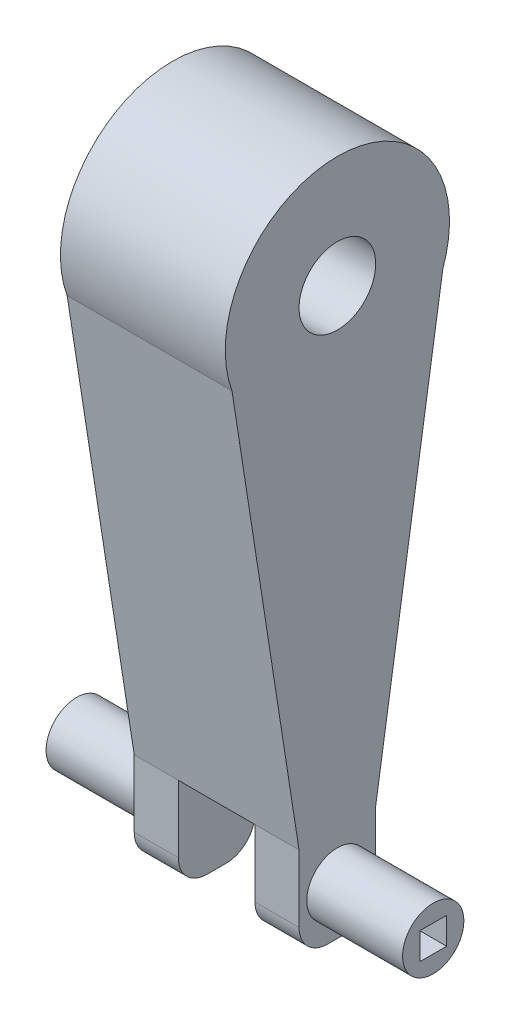
ISO-10303-21;
HEADER;
FILE_DESCRIPTION(('STEP AP214'),'2;1');
FILE_NAME('part.step','',(''),(''),'','','');
FILE_SCHEMA(('AUTOMOTIVE_DESIGN { 1 0 10303 214 1 1 1 1 }'));
ENDSEC;
DATA;
#1=APPLICATION_CONTEXT('core data for automotive mechanical design processes');
#2=APPLICATION_PROTOCOL_DEFINITION('international standard','automotive_design',2000,#1);
#3=PRODUCT_CONTEXT('',#1,'mechanical');
#4=PRODUCT('Part','Part','',(#3));
#5=PRODUCT_RELATED_PRODUCT_CATEGORY('part','',(#4));
#6=PRODUCT_DEFINITION_FORMATION('','',#4);
#7=PRODUCT_DEFINITION_CONTEXT('part definition',#1,'design');
#8=PRODUCT_DEFINITION('design','',#6,#7);
#9=PRODUCT_DEFINITION_SHAPE('','',#8);
#10=(LENGTH_UNIT() NAMED_UNIT(*) SI_UNIT(.MILLI.,.METRE.));
#11=(NAMED_UNIT(*) PLANE_ANGLE_UNIT() SI_UNIT($,.RADIAN.));
#12=(NAMED_UNIT(*) SI_UNIT($,.STERADIAN.) SOLID_ANGLE_UNIT());
#13=UNCERTAINTY_MEASURE_WITH_UNIT(LENGTH_MEASURE(1.E-05),#10,'distance_accuracy_value','');
#14=(GEOMETRIC_REPRESENTATION_CONTEXT(3) GLOBAL_UNCERTAINTY_ASSIGNED_CONTEXT((#13)) GLOBAL_UNIT_ASSIGNED_CONTEXT((#10,
#11,#12)) REPRESENTATION_CONTEXT('',''));
#15=CARTESIAN_POINT('',(0.,0.,0.));
#16=DIRECTION('',(0.,0.,1.));
#17=DIRECTION('',(1.,0.,0.));
#18=AXIS2_PLACEMENT_3D('',#15,#16,#17);
#19=CARTESIAN_POINT('',(430.,0.,-100.));
#20=DIRECTION('',(0.,0.,1.));
#21=DIRECTION('',(1.,0.,0.));
#22=AXIS2_PLACEMENT_3D('',#19,#20,#21);
#23=PLANE('',#22);
#24=DIRECTION('',(-1.,0.,0.));
#25=VECTOR('',#24,1.);
#26=CARTESIAN_POINT('',(430.,-1224.65565713997,-100.));
#27=LINE('',#26,#25);
#28=CARTESIAN_POINT('',(115.,-1224.65565713997,-100.));
#29=VERTEX_POINT('',#28);
#30=CARTESIAN_POINT('',(0.,-1224.65565713997,-100.));
#31=VERTEX_POINT('',#30);
#32=EDGE_CURVE('E372',#29,#31,#27,.T.);
#33=ORIENTED_EDGE('',*,*,#32,.F.);
#34=DIRECTION('',(0.,-1.,0.));
#35=VECTOR('',#34,1.);
#36=CARTESIAN_POINT('',(115.,0.,-100.));
#37=LINE('',#36,#35);
#38=CARTESIAN_POINT('',(115.,-1399.65565713997,-100.));
#39=VERTEX_POINT('',#38);
#40=EDGE_CURVE('E278',#29,#39,#37,.T.);
#41=ORIENTED_EDGE('',*,*,#40,.T.);
#42=DIRECTION('',(-1.,0.,0.));
#43=VECTOR('',#42,1.);
#44=CARTESIAN_POINT('',(430.,-1399.65565713997,-100.));
#45=LINE('',#44,#43);
#46=CARTESIAN_POINT('',(0.,-1399.65565713997,-100.));
#47=VERTEX_POINT('',#46);
#48=EDGE_CURVE('E324',#39,#47,#45,.T.);
#49=ORIENTED_EDGE('',*,*,#48,.T.);
#50=DIRECTION('',(0.,1.,0.));
#51=VECTOR('',#50,1.);
#52=CARTESIAN_POINT('',(0.,0.,-100.));
#53=LINE('',#52,#51);
#54=EDGE_CURVE('E300',#47,#31,#53,.T.);
#55=ORIENTED_EDGE('',*,*,#54,.T.);
#56=EDGE_LOOP('',(#33,#41,#49,#55));
#57=FACE_BOUND('',#56,.T.);
#58=ADVANCED_FACE('F41',(#57),#23,.F.);
#59=CARTESIAN_POINT('',(430.,0.,99.9999999999999));
#60=DIRECTION('',(0.,0.,1.));
#61=DIRECTION('',(1.,0.,0.));
#62=AXIS2_PLACEMENT_3D('',#59,#60,#61);
#63=PLANE('',#62);
#64=DIRECTION('',(0.,-1.,0.));
#65=VECTOR('',#64,1.);
#66=CARTESIAN_POINT('',(115.,-1224.65565713997,99.9999999999999));
#67=LINE('',#66,#65);
#68=CARTESIAN_POINT('',(115.,-1224.65565713997,99.9999999999999));
#69=VERTEX_POINT('',#68);
#70=CARTESIAN_POINT('',(115.,-1399.65565713997,99.9999999999999));
#71=VERTEX_POINT('',#70);
#72=EDGE_CURVE('E251',#69,#71,#67,.T.);
#73=ORIENTED_EDGE('',*,*,#72,.F.);
#74=DIRECTION('',(-1.,0.,0.));
#75=VECTOR('',#74,1.);
#76=CARTESIAN_POINT('',(430.,-1224.65565713997,99.9999999999999));
#77=LINE('',#76,#75);
#78=CARTESIAN_POINT('',(0.,-1224.65565713997,99.9999999999999));
#79=VERTEX_POINT('',#78);
#80=EDGE_CURVE('E365',#69,#79,#77,.T.);
#81=ORIENTED_EDGE('',*,*,#80,.T.);
#82=DIRECTION('',(0.,1.,0.));
#83=VECTOR('',#82,1.);
#84=CARTESIAN_POINT('',(0.,0.,99.9999999999999));
#85=LINE('',#84,#83);
#86=CARTESIAN_POINT('',(0.,-1399.65565713997,99.9999999999999));
#87=VERTEX_POINT('',#86);
#88=EDGE_CURVE('E333',#87,#79,#85,.T.);
#89=ORIENTED_EDGE('',*,*,#88,.F.);
#90=DIRECTION('',(-1.,0.,0.));
#91=VECTOR('',#90,1.);
#92=CARTESIAN_POINT('',(430.,-1399.65565713997,99.9999999999999));
#93=LINE('',#92,#91);
#94=EDGE_CURVE('E359',#71,#87,#93,.T.);
#95=ORIENTED_EDGE('',*,*,#94,.F.);
#96=EDGE_LOOP('',(#73,#81,#89,#95));
#97=FACE_BOUND('',#96,.T.);
#98=ADVANCED_FACE('F420',(#97),#63,.T.);
#99=CARTESIAN_POINT('',(430.,-1399.65565713997,24.9999999999999));
#100=DIRECTION('',(-1.,0.,0.));
#101=DIRECTION('',(0.,0.,1.));
#102=AXIS2_PLACEMENT_3D('',#99,#100,#101);
#103=CYLINDRICAL_SURFACE('',#102,75.);
#104=CARTESIAN_POINT('',(115.,-1399.65565713997,24.9999999999999));
#105=DIRECTION('',(-1.,0.,0.));
#106=DIRECTION('',(0.,-1.,0.));
#107=AXIS2_PLACEMENT_3D('',#104,#105,#106);
#108=CIRCLE('',#107,75.);
#109=CARTESIAN_POINT('',(115.,-1474.65565713997,24.9999999999994));
#110=VERTEX_POINT('',#109);
#111=EDGE_CURVE('E282',#71,#110,#108,.F.);
#112=ORIENTED_EDGE('',*,*,#111,.F.);
#113=ORIENTED_EDGE('',*,*,#94,.T.);
#114=CARTESIAN_POINT('',(0.,-1399.65565713997,24.9999999999999));
#115=DIRECTION('',(1.,0.,0.));
#116=DIRECTION('',(0.,0.,-1.));
#117=AXIS2_PLACEMENT_3D('',#114,#115,#116);
#118=CIRCLE('',#117,75.);
#119=CARTESIAN_POINT('',(0.,-1474.65565713997,24.9999999999994));
#120=VERTEX_POINT('',#119);
#121=EDGE_CURVE('E337',#120,#87,#118,.F.);
#122=ORIENTED_EDGE('',*,*,#121,.F.);
#123=DIRECTION('',(-1.,0.,0.));
#124=VECTOR('',#123,1.);
#125=CARTESIAN_POINT('',(430.,-1474.65565713997,24.9999999999994));
#126=LINE('',#125,#124);
#127=EDGE_CURVE('E356',#110,#120,#126,.T.);
#128=ORIENTED_EDGE('',*,*,#127,.F.);
#129=EDGE_LOOP('',(#112,#113,#122,#128));
#130=FACE_BOUND('',#129,.T.);
#131=ADVANCED_FACE('F426',(#130),#103,.T.);
#132=CARTESIAN_POINT('',(430.,-1474.65565713997,0.));
#133=DIRECTION('',(0.,-1.,0.));
#134=DIRECTION('',(0.,0.,-1.));
#135=AXIS2_PLACEMENT_3D('',#132,#133,#134);
#136=PLANE('',#135);
#137=DIRECTION('',(0.,0.,1.));
#138=VECTOR('',#137,1.);
#139=CARTESIAN_POINT('',(115.,-1474.65565713997,-580.));
#140=LINE('',#139,#138);
#141=CARTESIAN_POINT('',(115.,-1474.65565713997,-25.0000000000001));
#142=VERTEX_POINT('',#141);
#143=EDGE_CURVE('E266',#142,#110,#140,.T.);
#144=ORIENTED_EDGE('',*,*,#143,.T.);
#145=ORIENTED_EDGE('',*,*,#127,.T.);
#146=DIRECTION('',(0.,0.,1.));
#147=VECTOR('',#146,1.);
#148=CARTESIAN_POINT('',(0.,-1474.65565713997,0.));
#149=LINE('',#148,#147);
#150=CARTESIAN_POINT('',(0.,-1474.65565713997,-24.9999999999996));
#151=VERTEX_POINT('',#150);
#152=EDGE_CURVE('E341',#151,#120,#149,.T.);
#153=ORIENTED_EDGE('',*,*,#152,.F.);
#154=DIRECTION('',(-1.,0.,0.));
#155=VECTOR('',#154,1.);
#156=CARTESIAN_POINT('',(430.,-1474.65565713997,-24.9999999999996));
#157=LINE('',#156,#155);
#158=EDGE_CURVE('E355',#142,#151,#157,.T.);
#159=ORIENTED_EDGE('',*,*,#158,.F.);
#160=EDGE_LOOP('',(#144,#145,#153,#159));
#161=FACE_BOUND('',#160,.T.);
#162=ADVANCED_FACE('F429',(#161),#136,.T.);
#163=CARTESIAN_POINT('',(430.,-1399.65565713997,-25.0000000000001));
#164=DIRECTION('',(-1.,0.,0.));
#165=DIRECTION('',(0.,0.,1.));
#166=AXIS2_PLACEMENT_3D('',#163,#164,#165);
#167=CYLINDRICAL_SURFACE('',#166,75.);
#168=ORIENTED_EDGE('',*,*,#48,.F.);
#169=CARTESIAN_POINT('',(115.,-1399.65565713997,-25.0000000000001));
#170=DIRECTION('',(-1.,0.,0.));
#171=DIRECTION('',(0.,-1.,0.));
#172=AXIS2_PLACEMENT_3D('',#169,#170,#171);
#173=CIRCLE('',#172,75.);
#174=EDGE_CURVE('E11',#39,#142,#173,.T.);
#175=ORIENTED_EDGE('',*,*,#174,.T.);
#176=ORIENTED_EDGE('',*,*,#158,.T.);
#177=CARTESIAN_POINT('',(0.,-1399.65565713997,-25.0000000000001));
#178=DIRECTION('',(1.,0.,0.));
#179=DIRECTION('',(0.,0.,-1.));
#180=AXIS2_PLACEMENT_3D('',#177,#178,#179);
#181=CIRCLE('',#180,75.);
#182=EDGE_CURVE('E342',#151,#47,#181,.T.);
#183=ORIENTED_EDGE('',*,*,#182,.T.);
#184=EDGE_LOOP('',(#168,#175,#176,#183));
#185=FACE_BOUND('',#184,.T.);
#186=ADVANCED_FACE('F432',(#185),#167,.T.);
#187=CARTESIAN_POINT('',(430.,-1399.65565713997,-100.));
#188=VERTEX_POINT('',#187);
#189=CARTESIAN_POINT('',(315.,-1399.65565713997,-100.));
#190=VERTEX_POINT('',#189);
#191=EDGE_CURVE('E349',#188,#190,#45,.T.);
#192=ORIENTED_EDGE('',*,*,#191,.T.);
#193=DIRECTION('',(0.,1.,0.));
#194=VECTOR('',#193,1.);
#195=CARTESIAN_POINT('',(315.,0.,-100.));
#196=LINE('',#195,#194);
#197=CARTESIAN_POINT('',(315.,-1224.65565713997,-100.));
#198=VERTEX_POINT('',#197);
#199=EDGE_CURVE('E267',#190,#198,#196,.T.);
#200=ORIENTED_EDGE('',*,*,#199,.T.);
#201=CARTESIAN_POINT('',(430.,-1224.65565713997,-100.));
#202=VERTEX_POINT('',#201);
#203=EDGE_CURVE('E374',#202,#198,#27,.T.);
#204=ORIENTED_EDGE('',*,*,#203,.F.);
#205=DIRECTION('',(0.,1.,0.));
#206=VECTOR('',#205,1.);
#207=CARTESIAN_POINT('',(430.,0.,-100.));
#208=LINE('',#207,#206);
#209=EDGE_CURVE('E297',#188,#202,#208,.T.);
#210=ORIENTED_EDGE('',*,*,#209,.F.);
#211=EDGE_LOOP('',(#192,#200,#204,#210));
#212=FACE_BOUND('',#211,.T.);
#213=ADVANCED_FACE('F43',(#212),#23,.F.);
#214=CARTESIAN_POINT('',(430.,-44.1215656701343,-283.638636450864));
#215=DIRECTION('',(0.,0.15370700628187,0.988116468954882));
#216=DIRECTION('',(0.,-0.988116468954882,0.15370700628187));
#217=AXIS2_PLACEMENT_3D('',#214,#215,#216);
#218=PLANE('',#217);
#219=DIRECTION('',(0.,0.988116468954882,-0.15370700628187));
#220=VECTOR('',#219,1.);
#221=CARTESIAN_POINT('',(0.,-44.1215656701343,-283.638636450864));
#222=LINE('',#221,#220);
#223=CARTESIAN_POINT('',(0.,-99.6556571399736,-275.));
#224=VERTEX_POINT('',#223);
#225=EDGE_CURVE('E327',#31,#224,#222,.T.);
#226=ORIENTED_EDGE('',*,*,#225,.T.);
#227=DIRECTION('',(-1.,0.,0.));
#228=VECTOR('',#227,1.);
#229=CARTESIAN_POINT('',(430.,-99.6556571399736,-275.));
#230=LINE('',#229,#228);
#231=CARTESIAN_POINT('',(430.,-99.6556571399736,-275.));
#232=VERTEX_POINT('',#231);
#233=EDGE_CURVE('E371',#232,#224,#230,.T.);
#234=ORIENTED_EDGE('',*,*,#233,.F.);
#235=DIRECTION('',(0.,0.988116468954882,-0.15370700628187));
#236=VECTOR('',#235,1.);
#237=CARTESIAN_POINT('',(430.,-44.1215656701343,-283.638636450864));
#238=LINE('',#237,#236);
#239=EDGE_CURVE('E301',#202,#232,#238,.T.);
#240=ORIENTED_EDGE('',*,*,#239,.F.);
#241=ORIENTED_EDGE('',*,*,#203,.T.);
#242=DIRECTION('',(-1.,0.,0.));
#243=VECTOR('',#242,1.);
#244=CARTESIAN_POINT('',(430.,-1224.65565713997,-100.));
#245=LINE('',#244,#243);
#246=EDGE_CURVE('E284',#198,#29,#245,.T.);
#247=ORIENTED_EDGE('',*,*,#246,.T.);
#248=ORIENTED_EDGE('',*,*,#32,.T.);
#249=EDGE_LOOP('',(#226,#234,#240,#241,#247,#248));
#250=FACE_BOUND('',#249,.T.);
#251=ADVANCED_FACE('F439',(#250),#218,.F.);
#252=CARTESIAN_POINT('',(430.,0.,0.));
#253=DIRECTION('',(-1.,0.,0.));
#254=DIRECTION('',(0.,0.,1.));
#255=AXIS2_PLACEMENT_3D('',#252,#253,#254);
#256=CYLINDRICAL_SURFACE('',#255,292.5);
#257=CARTESIAN_POINT('',(0.,0.,0.));
#258=DIRECTION('',(1.,0.,0.));
#259=DIRECTION('',(0.,0.,-1.));
#260=AXIS2_PLACEMENT_3D('',#257,#258,#259);
#261=CIRCLE('',#260,292.5);
#262=CARTESIAN_POINT('',(0.,-99.6556571399736,275.));
#263=VERTEX_POINT('',#262);
#264=EDGE_CURVE('E329',#224,#263,#261,.T.);
#265=ORIENTED_EDGE('',*,*,#264,.T.);
#266=DIRECTION('',(-1.,0.,0.));
#267=VECTOR('',#266,1.);
#268=CARTESIAN_POINT('',(430.,-99.6556571399736,275.));
#269=LINE('',#268,#267);
#270=CARTESIAN_POINT('',(430.,-99.6556571399736,275.));
#271=VERTEX_POINT('',#270);
#272=EDGE_CURVE('E366',#271,#263,#269,.T.);
#273=ORIENTED_EDGE('',*,*,#272,.F.);
#274=CARTESIAN_POINT('',(430.,0.,0.));
#275=DIRECTION('',(1.,0.,0.));
#276=DIRECTION('',(0.,0.,-1.));
#277=AXIS2_PLACEMENT_3D('',#274,#275,#276);
#278=CIRCLE('',#277,292.5);
#279=EDGE_CURVE('E302',#232,#271,#278,.T.);
#280=ORIENTED_EDGE('',*,*,#279,.F.);
#281=ORIENTED_EDGE('',*,*,#233,.T.);
#282=EDGE_LOOP('',(#265,#273,#280,#281));
#283=FACE_BOUND('',#282,.T.);
#284=ADVANCED_FACE('F444',(#283),#256,.T.);
#285=CARTESIAN_POINT('',(430.,-44.1215656701344,283.638636450864));
#286=DIRECTION('',(0.,0.153707006281871,-0.988116468954882));
#287=DIRECTION('',(0.,0.988116468954882,0.153707006281871));
#288=AXIS2_PLACEMENT_3D('',#285,#286,#287);
#289=PLANE('',#288);
#290=DIRECTION('',(0.,-0.988116468954882,-0.153707006281871));
#291=VECTOR('',#290,1.);
#292=CARTESIAN_POINT('',(0.,-44.1215656701344,283.638636450864));
#293=LINE('',#292,#291);
#294=EDGE_CURVE('E335',#263,#79,#293,.T.);
#295=ORIENTED_EDGE('',*,*,#294,.T.);
#296=ORIENTED_EDGE('',*,*,#80,.F.);
#297=DIRECTION('',(-1.,0.,0.));
#298=VECTOR('',#297,1.);
#299=CARTESIAN_POINT('',(115.,-1224.65565713997,99.9999999999999));
#300=LINE('',#299,#298);
#301=CARTESIAN_POINT('',(315.,-1224.65565713997,99.9999999999999));
#302=VERTEX_POINT('',#301);
#303=EDGE_CURVE('E263',#302,#69,#300,.T.);
#304=ORIENTED_EDGE('',*,*,#303,.F.);
#305=CARTESIAN_POINT('',(430.,-1224.65565713997,99.9999999999999));
#306=VERTEX_POINT('',#305);
#307=EDGE_CURVE('E364',#306,#302,#77,.T.);
#308=ORIENTED_EDGE('',*,*,#307,.F.);
#309=DIRECTION('',(0.,-0.988116468954882,-0.153707006281871));
#310=VECTOR('',#309,1.);
#311=CARTESIAN_POINT('',(430.,-44.1215656701344,283.638636450864));
#312=LINE('',#311,#310);
#313=EDGE_CURVE('E308',#271,#306,#312,.T.);
#314=ORIENTED_EDGE('',*,*,#313,.F.);
#315=ORIENTED_EDGE('',*,*,#272,.T.);
#316=EDGE_LOOP('',(#295,#296,#304,#308,#314,#315));
#317=FACE_BOUND('',#316,.T.);
#318=ADVANCED_FACE('F408',(#317),#289,.F.);
#319=DIRECTION('',(0.,1.,0.));
#320=VECTOR('',#319,1.);
#321=CARTESIAN_POINT('',(315.,-1224.65565713997,99.9999999999999));
#322=LINE('',#321,#320);
#323=CARTESIAN_POINT('',(315.,-1399.65565713997,99.9999999999999));
#324=VERTEX_POINT('',#323);
#325=EDGE_CURVE('E257',#324,#302,#322,.T.);
#326=ORIENTED_EDGE('',*,*,#325,.F.);
#327=CARTESIAN_POINT('',(430.,-1399.65565713997,99.9999999999999));
#328=VERTEX_POINT('',#327);
#329=EDGE_CURVE('E363',#328,#324,#93,.T.);
#330=ORIENTED_EDGE('',*,*,#329,.F.);
#331=DIRECTION('',(0.,1.,0.));
#332=VECTOR('',#331,1.);
#333=CARTESIAN_POINT('',(430.,0.,99.9999999999999));
#334=LINE('',#333,#332);
#335=EDGE_CURVE('E306',#328,#306,#334,.T.);
#336=ORIENTED_EDGE('',*,*,#335,.T.);
#337=ORIENTED_EDGE('',*,*,#307,.T.);
#338=EDGE_LOOP('',(#326,#330,#336,#337));
#339=FACE_BOUND('',#338,.T.);
#340=ADVANCED_FACE('F405',(#339),#63,.T.);
#341=CARTESIAN_POINT('',(315.,-1399.65565713997,24.9999999999999));
#342=DIRECTION('',(1.,0.,0.));
#343=DIRECTION('',(0.,1.,0.));
#344=AXIS2_PLACEMENT_3D('',#341,#342,#343);
#345=CIRCLE('',#344,75.);
#346=CARTESIAN_POINT('',(315.,-1474.65565713997,24.9999999999994));
#347=VERTEX_POINT('',#346);
#348=EDGE_CURVE('E279',#347,#324,#345,.F.);
#349=ORIENTED_EDGE('',*,*,#348,.F.);
#350=CARTESIAN_POINT('',(430.,-1474.65565713997,24.9999999999994));
#351=VERTEX_POINT('',#350);
#352=EDGE_CURVE('E360',#351,#347,#126,.T.);
#353=ORIENTED_EDGE('',*,*,#352,.F.);
#354=CARTESIAN_POINT('',(430.,-1399.65565713997,24.9999999999999));
#355=DIRECTION('',(1.,0.,0.));
#356=DIRECTION('',(0.,0.,-1.));
#357=AXIS2_PLACEMENT_3D('',#354,#355,#356);
#358=CIRCLE('',#357,75.);
#359=EDGE_CURVE('E313',#351,#328,#358,.F.);
#360=ORIENTED_EDGE('',*,*,#359,.T.);
#361=ORIENTED_EDGE('',*,*,#329,.T.);
#362=EDGE_LOOP('',(#349,#353,#360,#361));
#363=FACE_BOUND('',#362,.T.);
#364=ADVANCED_FACE('F399',(#363),#103,.T.);
#365=DIRECTION('',(0.,0.,1.));
#366=VECTOR('',#365,1.);
#367=CARTESIAN_POINT('',(315.,-1474.65565713997,-580.));
#368=LINE('',#367,#366);
#369=CARTESIAN_POINT('',(315.,-1474.65565713997,-25.0000000000001));
#370=VERTEX_POINT('',#369);
#371=EDGE_CURVE('E275',#370,#347,#368,.T.);
#372=ORIENTED_EDGE('',*,*,#371,.F.);
#373=CARTESIAN_POINT('',(430.,-1474.65565713997,-24.9999999999996));
#374=VERTEX_POINT('',#373);
#375=EDGE_CURVE('E352',#374,#370,#157,.T.);
#376=ORIENTED_EDGE('',*,*,#375,.F.);
#377=DIRECTION('',(0.,0.,1.));
#378=VECTOR('',#377,1.);
#379=CARTESIAN_POINT('',(430.,-1474.65565713997,0.));
#380=LINE('',#379,#378);
#381=EDGE_CURVE('E314',#374,#351,#380,.T.);
#382=ORIENTED_EDGE('',*,*,#381,.T.);
#383=ORIENTED_EDGE('',*,*,#352,.T.);
#384=EDGE_LOOP('',(#372,#376,#382,#383));
#385=FACE_BOUND('',#384,.T.);
#386=ADVANCED_FACE('F394',(#385),#136,.T.);
#387=ORIENTED_EDGE('',*,*,#375,.T.);
#388=CARTESIAN_POINT('',(315.,-1399.65565713997,-25.0000000000001));
#389=DIRECTION('',(1.,0.,0.));
#390=DIRECTION('',(0.,1.,0.));
#391=AXIS2_PLACEMENT_3D('',#388,#389,#390);
#392=CIRCLE('',#391,75.);
#393=EDGE_CURVE('E47',#370,#190,#392,.T.);
#394=ORIENTED_EDGE('',*,*,#393,.T.);
#395=ORIENTED_EDGE('',*,*,#191,.F.);
#396=CARTESIAN_POINT('',(430.,-1399.65565713997,-25.0000000000001));
#397=DIRECTION('',(1.,0.,0.));
#398=DIRECTION('',(0.,0.,-1.));
#399=AXIS2_PLACEMENT_3D('',#396,#397,#398);
#400=CIRCLE('',#399,75.);
#401=EDGE_CURVE('E320',#374,#188,#400,.T.);
#402=ORIENTED_EDGE('',*,*,#401,.F.);
#403=EDGE_LOOP('',(#387,#394,#395,#402));
#404=FACE_BOUND('',#403,.T.);
#405=ADVANCED_FACE('F379',(#404),#167,.T.);
#406=CARTESIAN_POINT('',(430.,0.,0.));
#407=DIRECTION('',(-1.,0.,0.));
#408=DIRECTION('',(0.,0.,1.));
#409=AXIS2_PLACEMENT_3D('',#406,#407,#408);
#410=CYLINDRICAL_SURFACE('',#409,100.);
#411=CARTESIAN_POINT('',(430.,0.,0.));
#412=DIRECTION('',(1.,0.,0.));
#413=DIRECTION('',(0.,0.,-1.));
#414=AXIS2_PLACEMENT_3D('',#411,#412,#413);
#415=CIRCLE('',#414,100.);
#416=CARTESIAN_POINT('',(430.,0.,-100.));
#417=VERTEX_POINT('',#416);
#418=EDGE_CURVE('E325',#417,#417,#415,.T.);
#419=ORIENTED_EDGE('',*,*,#418,.T.);
#420=EDGE_LOOP('',(#419));
#421=FACE_BOUND('',#420,.T.);
#422=CARTESIAN_POINT('',(0.,0.,0.));
#423=DIRECTION('',(1.,0.,0.));
#424=DIRECTION('',(0.,0.,-1.));
#425=AXIS2_PLACEMENT_3D('',#422,#423,#424);
#426=CIRCLE('',#425,100.);
#427=CARTESIAN_POINT('',(0.,0.,-100.));
#428=VERTEX_POINT('',#427);
#429=EDGE_CURVE('E305',#428,#428,#426,.T.);
#430=ORIENTED_EDGE('',*,*,#429,.F.);
#431=EDGE_LOOP('',(#430));
#432=FACE_BOUND('',#431,.T.);
#433=ADVANCED_FACE('F452',(#421,#432),#410,.F.);
#434=CARTESIAN_POINT('',(430.,0.,0.));
#435=DIRECTION('',(1.,0.,0.));
#436=DIRECTION('',(0.,0.,-1.));
#437=AXIS2_PLACEMENT_3D('',#434,#435,#436);
#438=PLANE('',#437);
#439=ORIENTED_EDGE('',*,*,#209,.T.);
#440=ORIENTED_EDGE('',*,*,#239,.T.);
#441=ORIENTED_EDGE('',*,*,#279,.T.);
#442=ORIENTED_EDGE('',*,*,#313,.T.);
#443=ORIENTED_EDGE('',*,*,#335,.F.);
#444=ORIENTED_EDGE('',*,*,#359,.F.);
#445=ORIENTED_EDGE('',*,*,#381,.F.);
#446=ORIENTED_EDGE('',*,*,#401,.T.);
#447=EDGE_LOOP('',(#439,#440,#441,#442,#443,#444,#445,#446));
#448=FACE_BOUND('',#447,.T.);
#449=CARTESIAN_POINT('',(430.,-1349.65565713997,-1.53080849893419E-13));
#450=DIRECTION('',(1.,0.,0.));
#451=DIRECTION('',(0.,0.,-1.));
#452=AXIS2_PLACEMENT_3D('',#449,#450,#451);
#453=CIRCLE('',#452,80.);
#454=CARTESIAN_POINT('',(430.,-1349.65565713997,-80.0000000000002));
#455=VERTEX_POINT('',#454);
#456=EDGE_CURVE('E317',#455,#455,#453,.T.);
#457=ORIENTED_EDGE('',*,*,#456,.F.);
#458=EDGE_LOOP('',(#457));
#459=FACE_BOUND('',#458,.T.);
#460=ORIENTED_EDGE('',*,*,#418,.F.);
#461=EDGE_LOOP('',(#460));
#462=FACE_BOUND('',#461,.T.);
#463=ADVANCED_FACE('F389',(#448,#459,#462),#438,.T.);
#464=CARTESIAN_POINT('',(0.,0.,0.));
#465=DIRECTION('',(1.,0.,0.));
#466=DIRECTION('',(0.,0.,-1.));
#467=AXIS2_PLACEMENT_3D('',#464,#465,#466);
#468=PLANE('',#467);
#469=CARTESIAN_POINT('',(0.,-1349.65565713997,-1.53080849893419E-13));
#470=DIRECTION('',(1.,0.,0.));
#471=DIRECTION('',(0.,0.,-1.));
#472=AXIS2_PLACEMENT_3D('',#469,#470,#471);
#473=CIRCLE('',#472,80.);
#474=CARTESIAN_POINT('',(0.,-1349.65565713997,-80.0000000000002));
#475=VERTEX_POINT('',#474);
#476=EDGE_CURVE('E288',#475,#475,#473,.T.);
#477=ORIENTED_EDGE('',*,*,#476,.T.);
#478=EDGE_LOOP('',(#477));
#479=FACE_BOUND('',#478,.T.);
#480=ORIENTED_EDGE('',*,*,#54,.F.);
#481=ORIENTED_EDGE('',*,*,#182,.F.);
#482=ORIENTED_EDGE('',*,*,#152,.T.);
#483=ORIENTED_EDGE('',*,*,#121,.T.);
#484=ORIENTED_EDGE('',*,*,#88,.T.);
#485=ORIENTED_EDGE('',*,*,#294,.F.);
#486=ORIENTED_EDGE('',*,*,#264,.F.);
#487=ORIENTED_EDGE('',*,*,#225,.F.);
#488=EDGE_LOOP('',(#480,#481,#482,#483,#484,#485,#486,#487));
#489=FACE_BOUND('',#488,.T.);
#490=ORIENTED_EDGE('',*,*,#429,.T.);
#491=EDGE_LOOP('',(#490));
#492=FACE_BOUND('',#491,.T.);
#493=ADVANCED_FACE('F446',(#479,#489,#492),#468,.F.);
#494=CARTESIAN_POINT('',(680.,-1349.65565713997,-1.53080849893419E-13));
#495=DIRECTION('',(-1.,0.,0.));
#496=DIRECTION('',(0.,0.,1.));
#497=AXIS2_PLACEMENT_3D('',#494,#495,#496);
#498=CYLINDRICAL_SURFACE('',#497,80.);
#499=ORIENTED_EDGE('',*,*,#456,.T.);
#500=EDGE_LOOP('',(#499));
#501=FACE_BOUND('',#500,.T.);
#502=CARTESIAN_POINT('',(680.,-1349.65565713997,-1.53080849893419E-13));
#503=DIRECTION('',(1.,0.,0.));
#504=DIRECTION('',(0.,0.,-1.));
#505=AXIS2_PLACEMENT_3D('',#502,#503,#504);
#506=CIRCLE('',#505,80.);
#507=CARTESIAN_POINT('',(680.,-1349.65565713997,-80.0000000000002));
#508=VERTEX_POINT('',#507);
#509=EDGE_CURVE('E295',#508,#508,#506,.T.);
#510=ORIENTED_EDGE('',*,*,#509,.F.);
#511=EDGE_LOOP('',(#510));
#512=FACE_BOUND('',#511,.T.);
#513=ADVANCED_FACE('F448',(#501,#512),#498,.T.);
#514=CARTESIAN_POINT('',(680.,0.,0.));
#515=DIRECTION('',(1.,0.,0.));
#516=DIRECTION('',(0.,0.,-1.));
#517=AXIS2_PLACEMENT_3D('',#514,#515,#516);
#518=PLANE('',#517);
#519=DIRECTION('',(0.,1.,0.));
#520=VECTOR('',#519,1.);
#521=CARTESIAN_POINT('',(680.,-1384.65565713997,-35.0000000000001));
#522=LINE('',#521,#520);
#523=CARTESIAN_POINT('',(680.,-1384.65565713997,-35.0000000000001));
#524=VERTEX_POINT('',#523);
#525=CARTESIAN_POINT('',(680.,-1314.65565713997,-35.0000000000001));
#526=VERTEX_POINT('',#525);
#527=EDGE_CURVE('E57',#524,#526,#522,.T.);
#528=ORIENTED_EDGE('',*,*,#527,.F.);
#529=DIRECTION('',(0.,0.,-1.));
#530=VECTOR('',#529,1.);
#531=CARTESIAN_POINT('',(680.,-1384.65565713997,34.9999999999999));
#532=LINE('',#531,#530);
#533=CARTESIAN_POINT('',(680.,-1384.65565713997,34.9999999999999));
#534=VERTEX_POINT('',#533);
#535=EDGE_CURVE('E209',#534,#524,#532,.T.);
#536=ORIENTED_EDGE('',*,*,#535,.F.);
#537=DIRECTION('',(0.,-1.,0.));
#538=VECTOR('',#537,1.);
#539=CARTESIAN_POINT('',(680.,-1384.65565713997,34.9999999999999));
#540=LINE('',#539,#538);
#541=CARTESIAN_POINT('',(680.,-1314.65565713997,34.9999999999999));
#542=VERTEX_POINT('',#541);
#543=EDGE_CURVE('E213',#542,#534,#540,.T.);
#544=ORIENTED_EDGE('',*,*,#543,.F.);
#545=DIRECTION('',(0.,0.,1.));
#546=VECTOR('',#545,1.);
#547=CARTESIAN_POINT('',(680.,-1314.65565713997,34.9999999999999));
#548=LINE('',#547,#546);
#549=EDGE_CURVE('E218',#526,#542,#548,.T.);
#550=ORIENTED_EDGE('',*,*,#549,.F.);
#551=EDGE_LOOP('',(#528,#536,#544,#550));
#552=FACE_BOUND('',#551,.T.);
#553=ORIENTED_EDGE('',*,*,#509,.T.);
#554=EDGE_LOOP('',(#553));
#555=FACE_BOUND('',#554,.T.);
#556=ADVANCED_FACE('F577',(#552,#555),#518,.T.);
#557=CARTESIAN_POINT('',(-250.,-1349.65565713997,-1.53080849893419E-13));
#558=DIRECTION('',(1.,0.,0.));
#559=DIRECTION('',(0.,0.,-1.));
#560=AXIS2_PLACEMENT_3D('',#557,#558,#559);
#561=CYLINDRICAL_SURFACE('',#560,80.);
#562=CARTESIAN_POINT('',(-250.,-1349.65565713997,-1.53080849893419E-13));
#563=DIRECTION('',(1.,0.,0.));
#564=DIRECTION('',(0.,0.,-1.));
#565=AXIS2_PLACEMENT_3D('',#562,#563,#564);
#566=CIRCLE('',#565,80.);
#567=CARTESIAN_POINT('',(-250.,-1349.65565713997,-80.0000000000002));
#568=VERTEX_POINT('',#567);
#569=EDGE_CURVE('E287',#568,#568,#566,.T.);
#570=ORIENTED_EDGE('',*,*,#569,.T.);
#571=EDGE_LOOP('',(#570));
#572=FACE_BOUND('',#571,.T.);
#573=ORIENTED_EDGE('',*,*,#476,.F.);
#574=EDGE_LOOP('',(#573));
#575=FACE_BOUND('',#574,.T.);
#576=ADVANCED_FACE('F573',(#572,#575),#561,.T.);
#577=CARTESIAN_POINT('',(-250.,0.,0.));
#578=DIRECTION('',(1.,0.,0.));
#579=DIRECTION('',(0.,0.,-1.));
#580=AXIS2_PLACEMENT_3D('',#577,#578,#579);
#581=PLANE('',#580);
#582=DIRECTION('',(0.,0.,-1.));
#583=VECTOR('',#582,1.);
#584=CARTESIAN_POINT('',(-250.,-1314.65565713997,-34.9999999999999));
#585=LINE('',#584,#583);
#586=CARTESIAN_POINT('',(-250.,-1314.65565713997,35.0000000000001));
#587=VERTEX_POINT('',#586);
#588=CARTESIAN_POINT('',(-250.,-1314.65565713997,-34.9999999999999));
#589=VERTEX_POINT('',#588);
#590=EDGE_CURVE('E242',#587,#589,#585,.T.);
#591=ORIENTED_EDGE('',*,*,#590,.F.);
#592=DIRECTION('',(0.,1.,0.));
#593=VECTOR('',#592,1.);
#594=CARTESIAN_POINT('',(-250.,-1384.65565713997,35.0000000000001));
#595=LINE('',#594,#593);
#596=CARTESIAN_POINT('',(-250.,-1384.65565713997,35.0000000000001));
#597=VERTEX_POINT('',#596);
#598=EDGE_CURVE('E63',#597,#587,#595,.T.);
#599=ORIENTED_EDGE('',*,*,#598,.F.);
#600=DIRECTION('',(0.,0.,1.));
#601=VECTOR('',#600,1.);
#602=CARTESIAN_POINT('',(-250.,-1384.65565713997,-34.9999999999999));
#603=LINE('',#602,#601);
#604=CARTESIAN_POINT('',(-250.,-1384.65565713997,-34.9999999999999));
#605=VERTEX_POINT('',#604);
#606=EDGE_CURVE('E235',#605,#597,#603,.T.);
#607=ORIENTED_EDGE('',*,*,#606,.F.);
#608=DIRECTION('',(0.,-1.,0.));
#609=VECTOR('',#608,1.);
#610=CARTESIAN_POINT('',(-250.,-1384.65565713997,-34.9999999999999));
#611=LINE('',#610,#609);
#612=EDGE_CURVE('E246',#589,#605,#611,.T.);
#613=ORIENTED_EDGE('',*,*,#612,.F.);
#614=EDGE_LOOP('',(#591,#599,#607,#613));
#615=FACE_BOUND('',#614,.T.);
#616=ORIENTED_EDGE('',*,*,#569,.F.);
#617=EDGE_LOOP('',(#616));
#618=FACE_BOUND('',#617,.T.);
#619=ADVANCED_FACE('F578',(#615,#618),#581,.F.);
#620=CARTESIAN_POINT('',(115.,-1224.65565713997,-580.));
#621=DIRECTION('',(0.,1.,0.));
#622=DIRECTION('',(0.,0.,1.));
#623=AXIS2_PLACEMENT_3D('',#620,#621,#622);
#624=PLANE('',#623);
#625=DIRECTION('',(0.,0.,1.));
#626=VECTOR('',#625,1.);
#627=CARTESIAN_POINT('',(315.,-1224.65565713997,-580.));
#628=LINE('',#627,#626);
#629=EDGE_CURVE('E269',#198,#302,#628,.T.);
#630=ORIENTED_EDGE('',*,*,#629,.T.);
#631=ORIENTED_EDGE('',*,*,#303,.T.);
#632=DIRECTION('',(0.,0.,1.));
#633=VECTOR('',#632,1.);
#634=CARTESIAN_POINT('',(115.,-1224.65565713997,-580.));
#635=LINE('',#634,#633);
#636=EDGE_CURVE('E270',#29,#69,#635,.T.);
#637=ORIENTED_EDGE('',*,*,#636,.F.);
#638=ORIENTED_EDGE('',*,*,#246,.F.);
#639=EDGE_LOOP('',(#630,#631,#637,#638));
#640=FACE_BOUND('',#639,.T.);
#641=ADVANCED_FACE('F412',(#640),#624,.F.);
#642=CARTESIAN_POINT('',(115.,-1224.65565713997,-580.));
#643=DIRECTION('',(-1.,0.,0.));
#644=DIRECTION('',(0.,-1.,0.));
#645=AXIS2_PLACEMENT_3D('',#642,#643,#644);
#646=PLANE('',#645);
#647=ORIENTED_EDGE('',*,*,#111,.T.);
#648=ORIENTED_EDGE('',*,*,#143,.F.);
#649=ORIENTED_EDGE('',*,*,#174,.F.);
#650=ORIENTED_EDGE('',*,*,#40,.F.);
#651=ORIENTED_EDGE('',*,*,#636,.T.);
#652=ORIENTED_EDGE('',*,*,#72,.T.);
#653=EDGE_LOOP('',(#647,#648,#649,#650,#651,#652));
#654=FACE_BOUND('',#653,.T.);
#655=ADVANCED_FACE('F421',(#654),#646,.F.);
#656=CARTESIAN_POINT('',(315.,-1224.65565713997,-580.));
#657=DIRECTION('',(1.,0.,0.));
#658=DIRECTION('',(0.,1.,0.));
#659=AXIS2_PLACEMENT_3D('',#656,#657,#658);
#660=PLANE('',#659);
#661=ORIENTED_EDGE('',*,*,#348,.T.);
#662=ORIENTED_EDGE('',*,*,#325,.T.);
#663=ORIENTED_EDGE('',*,*,#629,.F.);
#664=ORIENTED_EDGE('',*,*,#199,.F.);
#665=ORIENTED_EDGE('',*,*,#393,.F.);
#666=ORIENTED_EDGE('',*,*,#371,.T.);
#667=EDGE_LOOP('',(#661,#662,#663,#664,#665,#666));
#668=FACE_BOUND('',#667,.T.);
#669=ADVANCED_FACE('F400',(#668),#660,.F.);
#670=CARTESIAN_POINT('',(-150.,-1384.65565713997,35.0000000000001));
#671=DIRECTION('',(0.,0.,1.));
#672=DIRECTION('',(1.,0.,0.));
#673=AXIS2_PLACEMENT_3D('',#670,#671,#672);
#674=PLANE('',#673);
#675=ORIENTED_EDGE('',*,*,#598,.T.);
#676=DIRECTION('',(-1.,0.,0.));
#677=VECTOR('',#676,1.);
#678=CARTESIAN_POINT('',(-150.,-1314.65565713997,35.0000000000001));
#679=LINE('',#678,#677);
#680=CARTESIAN_POINT('',(-150.,-1314.65565713997,35.0000000000001));
#681=VERTEX_POINT('',#680);
#682=EDGE_CURVE('E241',#681,#587,#679,.T.);
#683=ORIENTED_EDGE('',*,*,#682,.F.);
#684=DIRECTION('',(0.,1.,0.));
#685=VECTOR('',#684,1.);
#686=CARTESIAN_POINT('',(-150.,-1384.65565713997,35.0000000000001));
#687=LINE('',#686,#685);
#688=CARTESIAN_POINT('',(-150.,-1384.65565713997,35.0000000000001));
#689=VERTEX_POINT('',#688);
#690=EDGE_CURVE('E227',#689,#681,#687,.T.);
#691=ORIENTED_EDGE('',*,*,#690,.F.);
#692=DIRECTION('',(-1.,0.,0.));
#693=VECTOR('',#692,1.);
#694=CARTESIAN_POINT('',(-150.,-1384.65565713997,35.0000000000001));
#695=LINE('',#694,#693);
#696=EDGE_CURVE('E253',#689,#597,#695,.T.);
#697=ORIENTED_EDGE('',*,*,#696,.T.);
#698=EDGE_LOOP('',(#675,#683,#691,#697));
#699=FACE_BOUND('',#698,.T.);
#700=ADVANCED_FACE('F656',(#699),#674,.F.);
#701=CARTESIAN_POINT('',(-150.,-1384.65565713997,-34.9999999999999));
#702=DIRECTION('',(0.,-1.,0.));
#703=DIRECTION('',(0.,0.,-1.));
#704=AXIS2_PLACEMENT_3D('',#701,#702,#703);
#705=PLANE('',#704);
#706=ORIENTED_EDGE('',*,*,#606,.T.);
#707=ORIENTED_EDGE('',*,*,#696,.F.);
#708=DIRECTION('',(0.,0.,1.));
#709=VECTOR('',#708,1.);
#710=CARTESIAN_POINT('',(-150.,-1384.65565713997,-34.9999999999999));
#711=LINE('',#710,#709);
#712=CARTESIAN_POINT('',(-150.,-1384.65565713997,-34.9999999999999));
#713=VERTEX_POINT('',#712);
#714=EDGE_CURVE('E236',#713,#689,#711,.T.);
#715=ORIENTED_EDGE('',*,*,#714,.F.);
#716=DIRECTION('',(-1.,0.,0.));
#717=VECTOR('',#716,1.);
#718=CARTESIAN_POINT('',(-150.,-1384.65565713997,-34.9999999999999));
#719=LINE('',#718,#717);
#720=EDGE_CURVE('E255',#713,#605,#719,.T.);
#721=ORIENTED_EDGE('',*,*,#720,.T.);
#722=EDGE_LOOP('',(#706,#707,#715,#721));
#723=FACE_BOUND('',#722,.T.);
#724=ADVANCED_FACE('F664',(#723),#705,.F.);
#725=CARTESIAN_POINT('',(-150.,-1384.65565713997,-34.9999999999999));
#726=DIRECTION('',(0.,0.,-1.));
#727=DIRECTION('',(-1.,0.,0.));
#728=AXIS2_PLACEMENT_3D('',#725,#726,#727);
#729=PLANE('',#728);
#730=ORIENTED_EDGE('',*,*,#612,.T.);
#731=ORIENTED_EDGE('',*,*,#720,.F.);
#732=DIRECTION('',(0.,-1.,0.));
#733=VECTOR('',#732,1.);
#734=CARTESIAN_POINT('',(-150.,-1384.65565713997,-34.9999999999999));
#735=LINE('',#734,#733);
#736=CARTESIAN_POINT('',(-150.,-1314.65565713997,-34.9999999999999));
#737=VERTEX_POINT('',#736);
#738=EDGE_CURVE('E234',#737,#713,#735,.T.);
#739=ORIENTED_EDGE('',*,*,#738,.F.);
#740=DIRECTION('',(-1.,0.,0.));
#741=VECTOR('',#740,1.);
#742=CARTESIAN_POINT('',(-150.,-1314.65565713997,-34.9999999999999));
#743=LINE('',#742,#741);
#744=EDGE_CURVE('E258',#737,#589,#743,.T.);
#745=ORIENTED_EDGE('',*,*,#744,.T.);
#746=EDGE_LOOP('',(#730,#731,#739,#745));
#747=FACE_BOUND('',#746,.T.);
#748=ADVANCED_FACE('F671',(#747),#729,.F.);
#749=CARTESIAN_POINT('',(-150.,-1314.65565713997,-34.9999999999999));
#750=DIRECTION('',(0.,1.,0.));
#751=DIRECTION('',(0.,0.,1.));
#752=AXIS2_PLACEMENT_3D('',#749,#750,#751);
#753=PLANE('',#752);
#754=ORIENTED_EDGE('',*,*,#590,.T.);
#755=ORIENTED_EDGE('',*,*,#744,.F.);
#756=DIRECTION('',(0.,0.,-1.));
#757=VECTOR('',#756,1.);
#758=CARTESIAN_POINT('',(-150.,-1314.65565713997,-34.9999999999999));
#759=LINE('',#758,#757);
#760=EDGE_CURVE('E231',#681,#737,#759,.T.);
#761=ORIENTED_EDGE('',*,*,#760,.F.);
#762=ORIENTED_EDGE('',*,*,#682,.T.);
#763=EDGE_LOOP('',(#754,#755,#761,#762));
#764=FACE_BOUND('',#763,.T.);
#765=ADVANCED_FACE('F678',(#764),#753,.F.);
#766=CARTESIAN_POINT('',(-150.,0.,0.));
#767=DIRECTION('',(1.,0.,0.));
#768=DIRECTION('',(0.,0.,-1.));
#769=AXIS2_PLACEMENT_3D('',#766,#767,#768);
#770=PLANE('',#769);
#771=ORIENTED_EDGE('',*,*,#690,.T.);
#772=ORIENTED_EDGE('',*,*,#760,.T.);
#773=ORIENTED_EDGE('',*,*,#738,.T.);
#774=ORIENTED_EDGE('',*,*,#714,.T.);
#775=EDGE_LOOP('',(#771,#772,#773,#774));
#776=FACE_BOUND('',#775,.T.);
#777=ADVANCED_FACE('F687',(#776),#770,.F.);
#778=CARTESIAN_POINT('',(580.,-1384.65565713997,-35.0000000000001));
#779=DIRECTION('',(0.,0.,-1.));
#780=DIRECTION('',(-1.,0.,0.));
#781=AXIS2_PLACEMENT_3D('',#778,#779,#780);
#782=PLANE('',#781);
#783=ORIENTED_EDGE('',*,*,#527,.T.);
#784=DIRECTION('',(1.,0.,0.));
#785=VECTOR('',#784,1.);
#786=CARTESIAN_POINT('',(580.,-1314.65565713997,-35.0000000000001));
#787=LINE('',#786,#785);
#788=CARTESIAN_POINT('',(580.,-1314.65565713997,-35.0000000000001));
#789=VERTEX_POINT('',#788);
#790=EDGE_CURVE('E187',#789,#526,#787,.T.);
#791=ORIENTED_EDGE('',*,*,#790,.F.);
#792=DIRECTION('',(0.,1.,0.));
#793=VECTOR('',#792,1.);
#794=CARTESIAN_POINT('',(580.,-1384.65565713997,-35.0000000000001));
#795=LINE('',#794,#793);
#796=CARTESIAN_POINT('',(580.,-1384.65565713997,-35.0000000000001));
#797=VERTEX_POINT('',#796);
#798=EDGE_CURVE('E195',#797,#789,#795,.T.);
#799=ORIENTED_EDGE('',*,*,#798,.F.);
#800=DIRECTION('',(1.,0.,0.));
#801=VECTOR('',#800,1.);
#802=CARTESIAN_POINT('',(580.,-1384.65565713997,-35.0000000000001));
#803=LINE('',#802,#801);
#804=EDGE_CURVE('E224',#797,#524,#803,.T.);
#805=ORIENTED_EDGE('',*,*,#804,.T.);
#806=EDGE_LOOP('',(#783,#791,#799,#805));
#807=FACE_BOUND('',#806,.T.);
#808=ADVANCED_FACE('F189',(#807),#782,.F.);
#809=CARTESIAN_POINT('',(580.,-1384.65565713997,34.9999999999999));
#810=DIRECTION('',(0.,-1.,0.));
#811=DIRECTION('',(0.,0.,-1.));
#812=AXIS2_PLACEMENT_3D('',#809,#810,#811);
#813=PLANE('',#812);
#814=ORIENTED_EDGE('',*,*,#535,.T.);
#815=ORIENTED_EDGE('',*,*,#804,.F.);
#816=DIRECTION('',(0.,0.,-1.));
#817=VECTOR('',#816,1.);
#818=CARTESIAN_POINT('',(580.,-1384.65565713997,34.9999999999999));
#819=LINE('',#818,#817);
#820=CARTESIAN_POINT('',(580.,-1384.65565713997,34.9999999999999));
#821=VERTEX_POINT('',#820);
#822=EDGE_CURVE('E196',#821,#797,#819,.T.);
#823=ORIENTED_EDGE('',*,*,#822,.F.);
#824=DIRECTION('',(1.,0.,0.));
#825=VECTOR('',#824,1.);
#826=CARTESIAN_POINT('',(580.,-1384.65565713997,34.9999999999999));
#827=LINE('',#826,#825);
#828=EDGE_CURVE('E223',#821,#534,#827,.T.);
#829=ORIENTED_EDGE('',*,*,#828,.T.);
#830=EDGE_LOOP('',(#814,#815,#823,#829));
#831=FACE_BOUND('',#830,.T.);
#832=ADVANCED_FACE('F706',(#831),#813,.F.);
#833=CARTESIAN_POINT('',(580.,-1384.65565713997,34.9999999999999));
#834=DIRECTION('',(0.,0.,1.));
#835=DIRECTION('',(1.,0.,0.));
#836=AXIS2_PLACEMENT_3D('',#833,#834,#835);
#837=PLANE('',#836);
#838=ORIENTED_EDGE('',*,*,#543,.T.);
#839=ORIENTED_EDGE('',*,*,#828,.F.);
#840=DIRECTION('',(0.,-1.,0.));
#841=VECTOR('',#840,1.);
#842=CARTESIAN_POINT('',(580.,-1384.65565713997,34.9999999999999));
#843=LINE('',#842,#841);
#844=CARTESIAN_POINT('',(580.,-1314.65565713997,34.9999999999999));
#845=VERTEX_POINT('',#844);
#846=EDGE_CURVE('E206',#845,#821,#843,.T.);
#847=ORIENTED_EDGE('',*,*,#846,.F.);
#848=DIRECTION('',(1.,0.,0.));
#849=VECTOR('',#848,1.);
#850=CARTESIAN_POINT('',(580.,-1314.65565713997,34.9999999999999));
#851=LINE('',#850,#849);
#852=EDGE_CURVE('E197',#845,#542,#851,.T.);
#853=ORIENTED_EDGE('',*,*,#852,.T.);
#854=EDGE_LOOP('',(#838,#839,#847,#853));
#855=FACE_BOUND('',#854,.T.);
#856=ADVANCED_FACE('F713',(#855),#837,.F.);
#857=CARTESIAN_POINT('',(580.,-1314.65565713997,34.9999999999999));
#858=DIRECTION('',(0.,1.,0.));
#859=DIRECTION('',(0.,0.,1.));
#860=AXIS2_PLACEMENT_3D('',#857,#858,#859);
#861=PLANE('',#860);
#862=ORIENTED_EDGE('',*,*,#549,.T.);
#863=ORIENTED_EDGE('',*,*,#852,.F.);
#864=DIRECTION('',(0.,0.,1.));
#865=VECTOR('',#864,1.);
#866=CARTESIAN_POINT('',(580.,-1314.65565713997,34.9999999999999));
#867=LINE('',#866,#865);
#868=EDGE_CURVE('E203',#789,#845,#867,.T.);
#869=ORIENTED_EDGE('',*,*,#868,.F.);
#870=ORIENTED_EDGE('',*,*,#790,.T.);
#871=EDGE_LOOP('',(#862,#863,#869,#870));
#872=FACE_BOUND('',#871,.T.);
#873=ADVANCED_FACE('F205',(#872),#861,.F.);
#874=CARTESIAN_POINT('',(580.,0.,0.));
#875=DIRECTION('',(-1.,0.,0.));
#876=DIRECTION('',(0.,0.,1.));
#877=AXIS2_PLACEMENT_3D('',#874,#875,#876);
#878=PLANE('',#877);
#879=ORIENTED_EDGE('',*,*,#798,.T.);
#880=ORIENTED_EDGE('',*,*,#868,.T.);
#881=ORIENTED_EDGE('',*,*,#846,.T.);
#882=ORIENTED_EDGE('',*,*,#822,.T.);
#883=EDGE_LOOP('',(#879,#880,#881,#882));
#884=FACE_BOUND('',#883,.T.);
#885=ADVANCED_FACE('F208',(#884),#878,.F.);
#886=CLOSED_SHELL('',(#58,#98,#131,#162,#186,#213,#251,#284,#318,#340,#364,#386,#405,#433,#463,
#493,#513,#556,#576,#619,#641,#655,#669,#700,#724,#748,#765,#777,#808,#832,#856,#873,#885));
#887=MANIFOLD_SOLID_BREP('B2',#886);
#888=ADVANCED_BREP_SHAPE_REPRESENTATION('',(#18,#887),#14);
#889=SHAPE_DEFINITION_REPRESENTATION(#9,#888);
ENDSEC;
END-ISO-10303-21;
